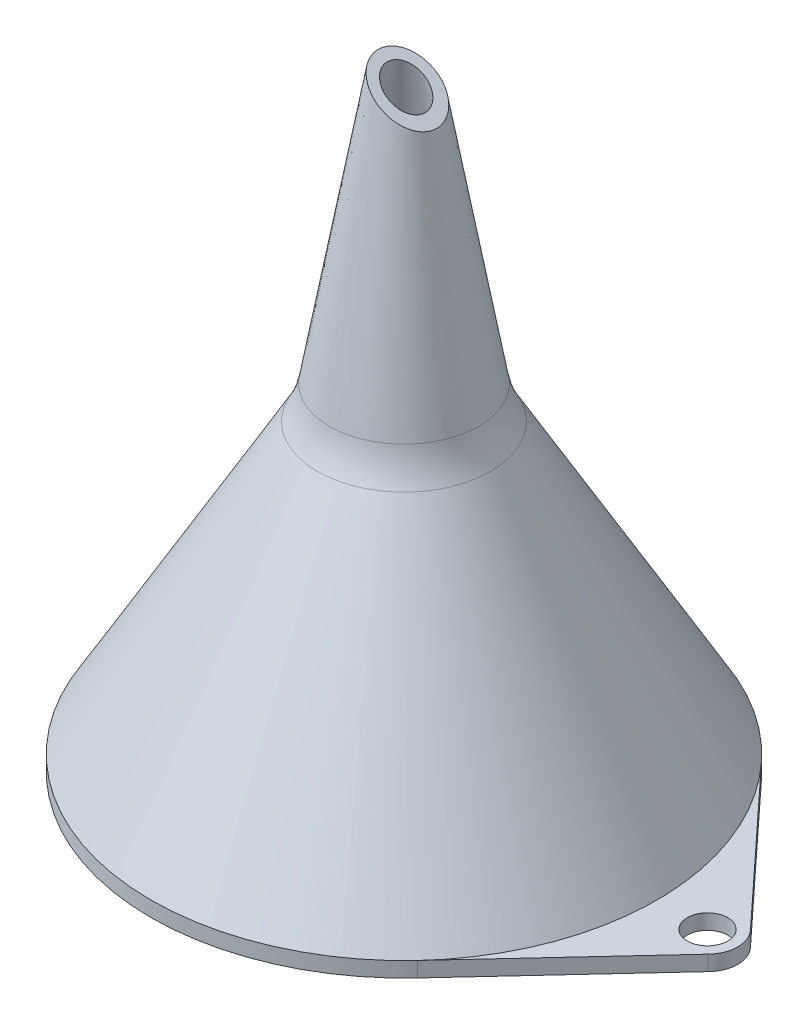
ISO-10303-21;
HEADER;
FILE_DESCRIPTION(('STEP AP214'),'2;1');
FILE_NAME('part.step','',(''),(''),'','','');
FILE_SCHEMA(('AUTOMOTIVE_DESIGN { 1 0 10303 214 1 1 1 1 }'));
ENDSEC;
DATA;
#1=APPLICATION_CONTEXT('core data for automotive mechanical design processes');
#2=APPLICATION_PROTOCOL_DEFINITION('international standard','automotive_design',2000,#1);
#3=PRODUCT_CONTEXT('',#1,'mechanical');
#4=PRODUCT('Part','Part','',(#3));
#5=PRODUCT_RELATED_PRODUCT_CATEGORY('part','',(#4));
#6=PRODUCT_DEFINITION_FORMATION('','',#4);
#7=PRODUCT_DEFINITION_CONTEXT('part definition',#1,'design');
#8=PRODUCT_DEFINITION('design','',#6,#7);
#9=PRODUCT_DEFINITION_SHAPE('','',#8);
#10=(LENGTH_UNIT() NAMED_UNIT(*) SI_UNIT(.MILLI.,.METRE.));
#11=(NAMED_UNIT(*) PLANE_ANGLE_UNIT() SI_UNIT($,.RADIAN.));
#12=(NAMED_UNIT(*) SI_UNIT($,.STERADIAN.) SOLID_ANGLE_UNIT());
#13=UNCERTAINTY_MEASURE_WITH_UNIT(LENGTH_MEASURE(1.E-05),#10,'distance_accuracy_value','');
#14=(GEOMETRIC_REPRESENTATION_CONTEXT(3) GLOBAL_UNCERTAINTY_ASSIGNED_CONTEXT((#13)) GLOBAL_UNIT_ASSIGNED_CONTEXT((#10,
#11,#12)) REPRESENTATION_CONTEXT('',''));
#15=CARTESIAN_POINT('',(0.,0.,0.));
#16=DIRECTION('',(0.,0.,1.));
#17=DIRECTION('',(1.,0.,0.));
#18=AXIS2_PLACEMENT_3D('',#15,#16,#17);
#19=CARTESIAN_POINT('',(0.,0.,0.));
#20=DIRECTION('',(0.,1.,0.));
#21=DIRECTION('',(1.,0.,0.));
#22=AXIS2_PLACEMENT_3D('',#19,#20,#21);
#23=CYLINDRICAL_SURFACE('',#22,25.);
#24=CARTESIAN_POINT('',(0.,1.,0.));
#25=DIRECTION('',(0.,1.,0.));
#26=DIRECTION('',(1.,0.,0.));
#27=AXIS2_PLACEMENT_3D('',#24,#25,#26);
#28=CIRCLE('',#27,25.);
#29=CARTESIAN_POINT('',(18.3341288650741,1.,-16.9958735803387));
#30=VERTEX_POINT('',#29);
#31=CARTESIAN_POINT('',(18.3341288650741,1.,16.9958735803387));
#32=VERTEX_POINT('',#31);
#33=EDGE_CURVE('E11',#30,#32,#28,.T.);
#34=ORIENTED_EDGE('',*,*,#33,.F.);
#35=DIRECTION('',(0.,-1.,0.));
#36=VECTOR('',#35,1.);
#37=CARTESIAN_POINT('',(18.3341288650741,0.,-16.9958735803387));
#38=LINE('',#37,#36);
#39=CARTESIAN_POINT('',(18.3341288650741,-0.5,-16.9958735803387));
#40=VERTEX_POINT('',#39);
#41=EDGE_CURVE('E22',#30,#40,#38,.T.);
#42=ORIENTED_EDGE('',*,*,#41,.T.);
#43=CARTESIAN_POINT('',(0.,-0.5,0.));
#44=DIRECTION('',(0.,-1.,0.));
#45=DIRECTION('',(1.,0.,0.));
#46=AXIS2_PLACEMENT_3D('',#43,#44,#45);
#47=CIRCLE('',#46,25.);
#48=CARTESIAN_POINT('',(18.3341288650741,-0.5,16.9958735803387));
#49=VERTEX_POINT('',#48);
#50=EDGE_CURVE('E111',#49,#40,#47,.T.);
#51=ORIENTED_EDGE('',*,*,#50,.F.);
#52=DIRECTION('',(0.,-1.,0.));
#53=VECTOR('',#52,1.);
#54=CARTESIAN_POINT('',(18.3341288650741,0.,16.9958735803387));
#55=LINE('',#54,#53);
#56=EDGE_CURVE('E144',#32,#49,#55,.T.);
#57=ORIENTED_EDGE('',*,*,#56,.F.);
#58=EDGE_LOOP('',(#34,#42,#51,#57));
#59=FACE_BOUND('',#58,.T.);
#60=ADVANCED_FACE('F19',(#59),#23,.T.);
#61=CARTESIAN_POINT('',(0.,0.,0.));
#62=DIRECTION('',(0.,1.,0.));
#63=DIRECTION('',(1.,0.,0.));
#64=AXIS2_PLACEMENT_3D('',#61,#62,#63);
#65=CYLINDRICAL_SURFACE('',#64,24.);
#66=CARTESIAN_POINT('',(0.,0.73205080756888,0.));
#67=DIRECTION('',(0.,1.,0.));
#68=DIRECTION('',(1.,0.,0.));
#69=AXIS2_PLACEMENT_3D('',#66,#67,#68);
#70=CIRCLE('',#69,24.);
#71=CARTESIAN_POINT('',(-24.,0.73205080756888,0.));
#72=VERTEX_POINT('',#71);
#73=EDGE_CURVE('E177',#72,#72,#70,.T.);
#74=ORIENTED_EDGE('',*,*,#73,.T.);
#75=EDGE_LOOP('',(#74));
#76=FACE_BOUND('',#75,.T.);
#77=CARTESIAN_POINT('',(0.,-0.5,0.));
#78=DIRECTION('',(0.,1.,0.));
#79=DIRECTION('',(1.,0.,0.));
#80=AXIS2_PLACEMENT_3D('',#77,#78,#79);
#81=CIRCLE('',#80,24.);
#82=CARTESIAN_POINT('',(-24.,-0.5,0.));
#83=VERTEX_POINT('',#82);
#84=EDGE_CURVE('E154',#83,#83,#81,.T.);
#85=ORIENTED_EDGE('',*,*,#84,.F.);
#86=EDGE_LOOP('',(#85));
#87=FACE_BOUND('',#86,.T.);
#88=ADVANCED_FACE('F225',(#76,#87),#65,.F.);
#89=CARTESIAN_POINT('',(-10.,65.,0.));
#90=DIRECTION('',(-0.554700196225229,-0.832050294337844,0.));
#91=DIRECTION('',(-0.832050294337844,0.554700196225229,0.));
#92=AXIS2_PLACEMENT_3D('',#89,#90,#91);
#93=PLANE('',#92);
#94=CARTESIAN_POINT('',(0.340894167815013,58.10607055479,0.));
#95=DIRECTION('',(-0.55470019622523,-0.832050294337843,0.));
#96=DIRECTION('',(-0.832050294337843,0.55470019622523,0.));
#97=AXIS2_PLACEMENT_3D('',#94,#95,#96);
#98=ELLIPSE('',#97,3.4853185729864,2.87985436543348);
#99=CARTESIAN_POINT('',(3.2408545123295,56.172763658447,0.));
#100=VERTEX_POINT('',#99);
#101=EDGE_CURVE('E29',#100,#100,#98,.T.);
#102=ORIENTED_EDGE('',*,*,#101,.F.);
#103=EDGE_LOOP('',(#102));
#104=FACE_BOUND('',#103,.T.);
#105=CARTESIAN_POINT('',(0.219856897871052,58.186762068086,0.));
#106=DIRECTION('',(0.554700196225231,0.832050294337842,0.));
#107=DIRECTION('',(-0.832050294337842,0.554700196225231,0.));
#108=AXIS2_PLACEMENT_3D('',#105,#106,#107);
#109=ELLIPSE('',#108,2.24782763067091,1.85733845540061);
#110=CARTESIAN_POINT('',(2.09016253959152,56.9398916402723,0.));
#111=VERTEX_POINT('',#110);
#112=EDGE_CURVE('E179',#111,#111,#109,.T.);
#113=ORIENTED_EDGE('',*,*,#112,.F.);
#114=EDGE_LOOP('',(#113));
#115=FACE_BOUND('',#114,.T.);
#116=ADVANCED_FACE('F251',(#104,#115),#93,.F.);
#117=CARTESIAN_POINT('',(0.,1.,0.));
#118=DIRECTION('',(0.,-1.,0.));
#119=DIRECTION('',(1.,0.,0.));
#120=AXIS2_PLACEMENT_3D('',#117,#118,#119);
#121=CONICAL_SURFACE('',#120,25.,0.523598775598299);
#122=CARTESIAN_POINT('',(0.,29.4729635533386,0.));
#123=DIRECTION('',(0.,1.,0.));
#124=DIRECTION('',(1.,0.,0.));
#125=AXIS2_PLACEMENT_3D('',#122,#123,#124);
#126=CIRCLE('',#125,8.56112682785356);
#127=CARTESIAN_POINT('',(-8.56112682785356,29.4729635533386,0.));
#128=VERTEX_POINT('',#127);
#129=EDGE_CURVE('E176',#128,#128,#126,.T.);
#130=ORIENTED_EDGE('',*,*,#129,.F.);
#131=EDGE_LOOP('',(#130));
#132=FACE_BOUND('',#131,.T.);
#133=ORIENTED_EDGE('',*,*,#33,.T.);
#134=CARTESIAN_POINT('',(0.,1.,0.));
#135=DIRECTION('',(0.,1.,0.));
#136=DIRECTION('',(1.,0.,0.));
#137=AXIS2_PLACEMENT_3D('',#134,#135,#136);
#138=CIRCLE('',#137,25.);
#139=EDGE_CURVE('E150',#32,#30,#138,.T.);
#140=ORIENTED_EDGE('',*,*,#139,.T.);
#141=EDGE_LOOP('',(#133,#140));
#142=FACE_BOUND('',#141,.T.);
#143=ADVANCED_FACE('F280',(#132,#142),#121,.T.);
#144=CARTESIAN_POINT('',(0.,31.,0.));
#145=DIRECTION('',(0.,-1.,0.));
#146=DIRECTION('',(1.,0.,0.));
#147=AXIS2_PLACEMENT_3D('',#144,#145,#146);
#148=CONICAL_SURFACE('',#147,7.67949192431123,0.174532925199433);
#149=CARTESIAN_POINT('',(0.,32.7364817766693,0.));
#150=DIRECTION('',(0.,-1.,0.));
#151=DIRECTION('',(1.,0.,0.));
#152=AXIS2_PLACEMENT_3D('',#149,#150,#151);
#153=CIRCLE('',#152,7.37330333557586);
#154=CARTESIAN_POINT('',(-7.37330333557586,32.7364817766693,0.));
#155=VERTEX_POINT('',#154);
#156=EDGE_CURVE('E173',#155,#155,#153,.T.);
#157=ORIENTED_EDGE('',*,*,#156,.F.);
#158=EDGE_LOOP('',(#157));
#159=FACE_BOUND('',#158,.T.);
#160=ORIENTED_EDGE('',*,*,#101,.T.);
#161=EDGE_LOOP('',(#160));
#162=FACE_BOUND('',#161,.T.);
#163=ADVANCED_FACE('F285',(#159,#162),#148,.T.);
#164=CARTESIAN_POINT('',(0.,34.4729635533386,0.));
#165=DIRECTION('',(0.,-1.,0.));
#166=DIRECTION('',(0.,0.,-1.));
#167=AXIS2_PLACEMENT_3D('',#164,#165,#166);
#168=TOROIDAL_SURFACE('',#167,17.2213808656979,10.);
#169=ORIENTED_EDGE('',*,*,#129,.T.);
#170=EDGE_LOOP('',(#169));
#171=FACE_BOUND('',#170,.T.);
#172=ORIENTED_EDGE('',*,*,#156,.T.);
#173=EDGE_LOOP('',(#172));
#174=FACE_BOUND('',#173,.T.);
#175=ADVANCED_FACE('F312',(#171,#174),#168,.F.);
#176=CARTESIAN_POINT('',(0.,0.5,0.));
#177=DIRECTION('',(0.,-1.,0.));
#178=DIRECTION('',(1.,0.,0.));
#179=AXIS2_PLACEMENT_3D('',#176,#177,#178);
#180=CONICAL_SURFACE('',#179,24.1339745962156,0.523598775598299);
#181=CARTESIAN_POINT('',(0.,28.9729635533386,0.));
#182=DIRECTION('',(0.,-1.,0.));
#183=DIRECTION('',(1.,0.,0.));
#184=AXIS2_PLACEMENT_3D('',#181,#182,#183);
#185=CIRCLE('',#184,7.69510142406912);
#186=CARTESIAN_POINT('',(-7.69510142406912,28.9729635533386,0.));
#187=VERTEX_POINT('',#186);
#188=EDGE_CURVE('E153',#187,#187,#185,.T.);
#189=ORIENTED_EDGE('',*,*,#188,.F.);
#190=EDGE_LOOP('',(#189));
#191=FACE_BOUND('',#190,.T.);
#192=ORIENTED_EDGE('',*,*,#73,.F.);
#193=EDGE_LOOP('',(#192));
#194=FACE_BOUND('',#193,.T.);
#195=ADVANCED_FACE('F295',(#191,#194),#180,.F.);
#196=CARTESIAN_POINT('',(0.,30.8263518223331,0.));
#197=DIRECTION('',(0.,-1.,0.));
#198=DIRECTION('',(1.,0.,0.));
#199=AXIS2_PLACEMENT_3D('',#196,#197,#198);
#200=CONICAL_SURFACE('',#199,6.69468417129902,0.174532925199433);
#201=CARTESIAN_POINT('',(0.,32.5628335990024,0.));
#202=DIRECTION('',(0.,1.,0.));
#203=DIRECTION('',(1.,0.,0.));
#204=AXIS2_PLACEMENT_3D('',#201,#202,#203);
#205=CIRCLE('',#204,6.38849558256366);
#206=CARTESIAN_POINT('',(-6.38849558256366,32.5628335990024,0.));
#207=VERTEX_POINT('',#206);
#208=EDGE_CURVE('E185',#207,#207,#205,.T.);
#209=ORIENTED_EDGE('',*,*,#208,.F.);
#210=EDGE_LOOP('',(#209));
#211=FACE_BOUND('',#210,.T.);
#212=ORIENTED_EDGE('',*,*,#112,.T.);
#213=EDGE_LOOP('',(#212));
#214=FACE_BOUND('',#213,.T.);
#215=ADVANCED_FACE('F263',(#211,#214),#200,.F.);
#216=CARTESIAN_POINT('',(0.,34.4729635533386,0.));
#217=DIRECTION('',(0.,-1.,0.));
#218=DIRECTION('',(0.,0.,-1.));
#219=AXIS2_PLACEMENT_3D('',#216,#217,#218);
#220=TOROIDAL_SURFACE('',#219,17.2213808656979,11.);
#221=ORIENTED_EDGE('',*,*,#208,.T.);
#222=EDGE_LOOP('',(#221));
#223=FACE_BOUND('',#222,.T.);
#224=ORIENTED_EDGE('',*,*,#188,.T.);
#225=EDGE_LOOP('',(#224));
#226=FACE_BOUND('',#225,.T.);
#227=ADVANCED_FACE('F258',(#223,#226),#220,.T.);
#228=CARTESIAN_POINT('',(4.,1.,0.));
#229=DIRECTION('',(0.,-1.,0.));
#230=DIRECTION('',(0.,0.,-1.));
#231=AXIS2_PLACEMENT_3D('',#228,#229,#230);
#232=PLANE('',#231);
#233=CARTESIAN_POINT('',(30.,1.,0.));
#234=DIRECTION('',(0.,-1.,0.));
#235=DIRECTION('',(-1.,0.,0.));
#236=AXIS2_PLACEMENT_3D('',#233,#234,#235);
#237=CIRCLE('',#236,2.);
#238=CARTESIAN_POINT('',(32.,1.,0.));
#239=VERTEX_POINT('',#238);
#240=EDGE_CURVE('E145',#239,#239,#237,.T.);
#241=ORIENTED_EDGE('',*,*,#240,.T.);
#242=EDGE_LOOP('',(#241));
#243=FACE_BOUND('',#242,.T.);
#244=ORIENTED_EDGE('',*,*,#139,.F.);
#245=DIRECTION('',(-0.679834943213549,0.,0.733365154602965));
#246=VECTOR('',#245,1.);
#247=CARTESIAN_POINT('',(26.1653894854791,1.,8.54797940698005));
#248=LINE('',#247,#246);
#249=CARTESIAN_POINT('',(32.1479479058273,1.,2.09435426655857));
#250=VERTEX_POINT('',#249);
#251=EDGE_CURVE('E141',#250,#32,#248,.T.);
#252=ORIENTED_EDGE('',*,*,#251,.F.);
#253=CARTESIAN_POINT('',(30.,1.,0.));
#254=DIRECTION('',(0.,-1.,0.));
#255=DIRECTION('',(-1.,0.,0.));
#256=AXIS2_PLACEMENT_3D('',#253,#254,#255);
#257=CIRCLE('',#256,3.);
#258=CARTESIAN_POINT('',(32.1999999972613,1.,-2.03960780839116));
#259=VERTEX_POINT('',#258);
#260=EDGE_CURVE('E131',#259,#250,#257,.T.);
#261=ORIENTED_EDGE('',*,*,#260,.F.);
#262=DIRECTION('',(0.679869269463719,0.,0.733333332420441));
#263=VECTOR('',#262,1.);
#264=CARTESIAN_POINT('',(19.258175524873,1.,-15.999161055184));
#265=LINE('',#264,#263);
#266=EDGE_CURVE('E116',#30,#259,#265,.T.);
#267=ORIENTED_EDGE('',*,*,#266,.F.);
#268=EDGE_LOOP('',(#244,#252,#261,#267));
#269=FACE_BOUND('',#268,.T.);
#270=ADVANCED_FACE('F167',(#243,#269),#232,.F.);
#271=CARTESIAN_POINT('',(4.,-0.5,0.));
#272=DIRECTION('',(0.,-1.,0.));
#273=DIRECTION('',(0.,0.,-1.));
#274=AXIS2_PLACEMENT_3D('',#271,#272,#273);
#275=PLANE('',#274);
#276=DIRECTION('',(0.679869269463719,0.,0.733333332420441));
#277=VECTOR('',#276,1.);
#278=CARTESIAN_POINT('',(19.258175524873,-0.5,-15.999161055184));
#279=LINE('',#278,#277);
#280=CARTESIAN_POINT('',(32.1999999972613,-0.5,-2.03960780839116));
#281=VERTEX_POINT('',#280);
#282=EDGE_CURVE('E102',#40,#281,#279,.T.);
#283=ORIENTED_EDGE('',*,*,#282,.T.);
#284=CARTESIAN_POINT('',(30.,-0.5,0.));
#285=DIRECTION('',(0.,-1.,0.));
#286=DIRECTION('',(-1.,0.,0.));
#287=AXIS2_PLACEMENT_3D('',#284,#285,#286);
#288=CIRCLE('',#287,3.);
#289=CARTESIAN_POINT('',(32.1479479058273,-0.5,2.09435426655857));
#290=VERTEX_POINT('',#289);
#291=EDGE_CURVE('E108',#281,#290,#288,.T.);
#292=ORIENTED_EDGE('',*,*,#291,.T.);
#293=DIRECTION('',(-0.679834943213549,0.,0.733365154602965));
#294=VECTOR('',#293,1.);
#295=CARTESIAN_POINT('',(26.1653894854791,-0.5,8.54797940698005));
#296=LINE('',#295,#294);
#297=EDGE_CURVE('E192',#290,#49,#296,.T.);
#298=ORIENTED_EDGE('',*,*,#297,.T.);
#299=ORIENTED_EDGE('',*,*,#50,.T.);
#300=EDGE_LOOP('',(#283,#292,#298,#299));
#301=FACE_BOUND('',#300,.T.);
#302=ORIENTED_EDGE('',*,*,#84,.T.);
#303=EDGE_LOOP('',(#302));
#304=FACE_BOUND('',#303,.T.);
#305=CARTESIAN_POINT('',(30.,-0.5,0.));
#306=DIRECTION('',(0.,1.,0.));
#307=DIRECTION('',(-1.,0.,0.));
#308=AXIS2_PLACEMENT_3D('',#305,#306,#307);
#309=CIRCLE('',#308,2.);
#310=CARTESIAN_POINT('',(32.,-0.5,0.));
#311=VERTEX_POINT('',#310);
#312=EDGE_CURVE('E148',#311,#311,#309,.T.);
#313=ORIENTED_EDGE('',*,*,#312,.T.);
#314=EDGE_LOOP('',(#313));
#315=FACE_BOUND('',#314,.T.);
#316=ADVANCED_FACE('F104',(#301,#304,#315),#275,.T.);
#317=CARTESIAN_POINT('',(18.3341288650741,0.,-16.9958735803387));
#318=DIRECTION('',(0.733333332420441,0.,-0.67986926946372));
#319=DIRECTION('',(0.,-1.,0.));
#320=AXIS2_PLACEMENT_3D('',#317,#318,#319);
#321=PLANE('',#320);
#322=ORIENTED_EDGE('',*,*,#266,.T.);
#323=DIRECTION('',(0.,-1.,0.));
#324=VECTOR('',#323,1.);
#325=CARTESIAN_POINT('',(32.1999999972613,0.,-2.03960780839116));
#326=LINE('',#325,#324);
#327=EDGE_CURVE('E119',#259,#281,#326,.T.);
#328=ORIENTED_EDGE('',*,*,#327,.T.);
#329=ORIENTED_EDGE('',*,*,#282,.F.);
#330=ORIENTED_EDGE('',*,*,#41,.F.);
#331=EDGE_LOOP('',(#322,#328,#329,#330));
#332=FACE_BOUND('',#331,.T.);
#333=ADVANCED_FACE('F120',(#332),#321,.T.);
#334=CARTESIAN_POINT('',(30.,0.,0.));
#335=DIRECTION('',(0.,-1.,0.));
#336=DIRECTION('',(-1.,0.,0.));
#337=AXIS2_PLACEMENT_3D('',#334,#335,#336);
#338=CYLINDRICAL_SURFACE('',#337,3.);
#339=ORIENTED_EDGE('',*,*,#260,.T.);
#340=DIRECTION('',(0.,-1.,0.));
#341=VECTOR('',#340,1.);
#342=CARTESIAN_POINT('',(32.1479479058273,0.,2.09435426655857));
#343=LINE('',#342,#341);
#344=EDGE_CURVE('E128',#250,#290,#343,.T.);
#345=ORIENTED_EDGE('',*,*,#344,.T.);
#346=ORIENTED_EDGE('',*,*,#291,.F.);
#347=ORIENTED_EDGE('',*,*,#327,.F.);
#348=EDGE_LOOP('',(#339,#345,#346,#347));
#349=FACE_BOUND('',#348,.T.);
#350=ADVANCED_FACE('F126',(#349),#338,.T.);
#351=CARTESIAN_POINT('',(32.1479479058273,0.,2.09435426655857));
#352=DIRECTION('',(0.733365154602965,0.,0.679834943213549));
#353=DIRECTION('',(0.,-1.,0.));
#354=AXIS2_PLACEMENT_3D('',#351,#352,#353);
#355=PLANE('',#354);
#356=ORIENTED_EDGE('',*,*,#251,.T.);
#357=ORIENTED_EDGE('',*,*,#56,.T.);
#358=ORIENTED_EDGE('',*,*,#297,.F.);
#359=ORIENTED_EDGE('',*,*,#344,.F.);
#360=EDGE_LOOP('',(#356,#357,#358,#359));
#361=FACE_BOUND('',#360,.T.);
#362=ADVANCED_FACE('F216',(#361),#355,.T.);
#363=CARTESIAN_POINT('',(30.,0.,0.));
#364=DIRECTION('',(0.,-1.,0.));
#365=DIRECTION('',(-1.,0.,0.));
#366=AXIS2_PLACEMENT_3D('',#363,#364,#365);
#367=CYLINDRICAL_SURFACE('',#366,2.);
#368=ORIENTED_EDGE('',*,*,#240,.F.);
#369=EDGE_LOOP('',(#368));
#370=FACE_BOUND('',#369,.T.);
#371=ORIENTED_EDGE('',*,*,#312,.F.);
#372=EDGE_LOOP('',(#371));
#373=FACE_BOUND('',#372,.T.);
#374=ADVANCED_FACE('F274',(#370,#373),#367,.F.);
#375=CLOSED_SHELL('',(#60,#88,#116,#143,#163,#175,#195,#215,#227,#270,#316,#333,#350,#362,#374));
#376=MANIFOLD_SOLID_BREP('B1',#375);
#377=ADVANCED_BREP_SHAPE_REPRESENTATION('',(#18,#376),#14);
#378=SHAPE_DEFINITION_REPRESENTATION(#9,#377);
ENDSEC;
END-ISO-10303-21;
